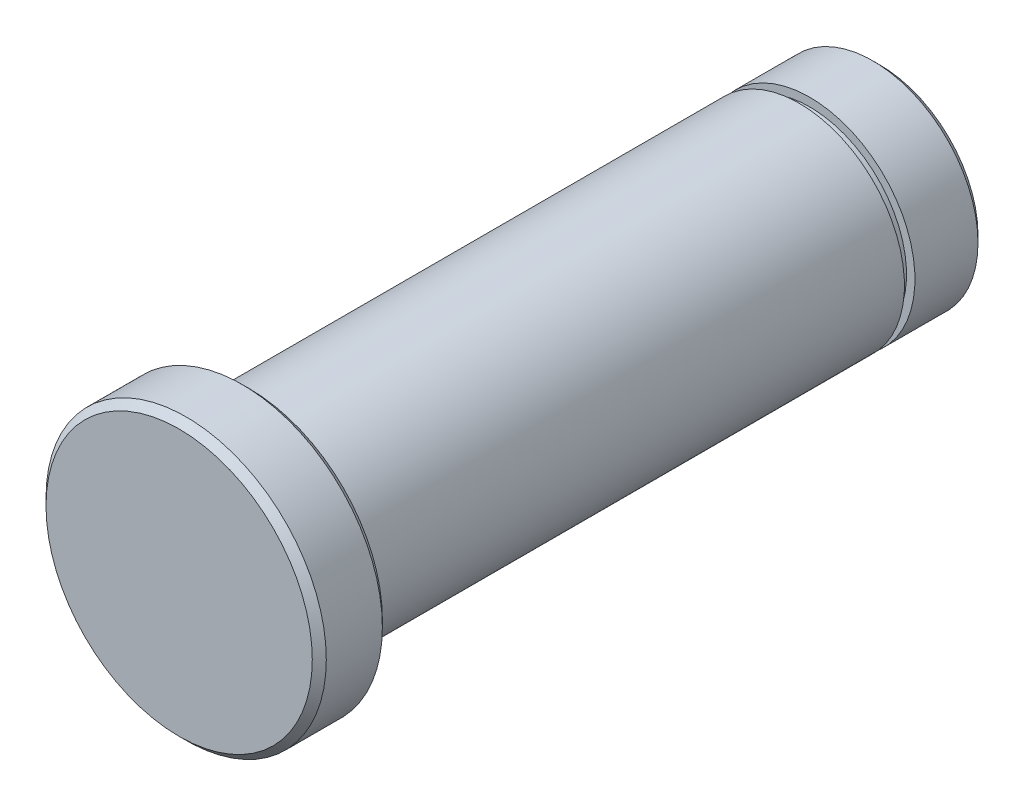
ISO-10303-21;
HEADER;
FILE_DESCRIPTION(('STEP AP214'),'2;1');
FILE_NAME('part.step','',(''),(''),'','','');
FILE_SCHEMA(('AUTOMOTIVE_DESIGN { 1 0 10303 214 1 1 1 1 }'));
ENDSEC;
DATA;
#1=APPLICATION_CONTEXT('core data for automotive mechanical design processes');
#2=APPLICATION_PROTOCOL_DEFINITION('international standard','automotive_design',2000,#1);
#3=PRODUCT_CONTEXT('',#1,'mechanical');
#4=PRODUCT('Part','Part','',(#3));
#5=PRODUCT_RELATED_PRODUCT_CATEGORY('part','',(#4));
#6=PRODUCT_DEFINITION_FORMATION('','',#4);
#7=PRODUCT_DEFINITION_CONTEXT('part definition',#1,'design');
#8=PRODUCT_DEFINITION('design','',#6,#7);
#9=PRODUCT_DEFINITION_SHAPE('','',#8);
#10=(LENGTH_UNIT() NAMED_UNIT(*) SI_UNIT(.MILLI.,.METRE.));
#11=(NAMED_UNIT(*) PLANE_ANGLE_UNIT() SI_UNIT($,.RADIAN.));
#12=(NAMED_UNIT(*) SI_UNIT($,.STERADIAN.) SOLID_ANGLE_UNIT());
#13=UNCERTAINTY_MEASURE_WITH_UNIT(LENGTH_MEASURE(1.E-05),#10,'distance_accuracy_value','');
#14=(GEOMETRIC_REPRESENTATION_CONTEXT(3) GLOBAL_UNCERTAINTY_ASSIGNED_CONTEXT((#13)) GLOBAL_UNIT_ASSIGNED_CONTEXT((#10,
#11,#12)) REPRESENTATION_CONTEXT('',''));
#15=CARTESIAN_POINT('',(0.,0.,0.));
#16=DIRECTION('',(0.,0.,1.));
#17=DIRECTION('',(1.,0.,0.));
#18=AXIS2_PLACEMENT_3D('',#15,#16,#17);
#19=CARTESIAN_POINT('',(0.,0.,90.));
#20=DIRECTION('',(0.,0.,-1.));
#21=DIRECTION('',(-1.,0.,0.));
#22=AXIS2_PLACEMENT_3D('',#19,#20,#21);
#23=CYLINDRICAL_SURFACE('',#22,15.);
#24=CARTESIAN_POINT('',(0.,0.,11.5));
#25=DIRECTION('',(0.,0.,1.));
#26=DIRECTION('',(1.,0.,0.));
#27=AXIS2_PLACEMENT_3D('',#24,#25,#26);
#28=CIRCLE('',#27,15.);
#29=CARTESIAN_POINT('',(-15.,0.,11.5));
#30=VERTEX_POINT('',#29);
#31=EDGE_CURVE('E61',#30,#30,#28,.T.);
#32=CARTESIAN_POINT('',(0.,0.,90.));
#33=DIRECTION('',(0.,0.,1.));
#34=DIRECTION('',(1.,0.,0.));
#35=AXIS2_PLACEMENT_3D('',#32,#33,#34);
#36=CIRCLE('',#35,15.);
#37=CARTESIAN_POINT('',(-15.,0.,90.));
#38=VERTEX_POINT('',#37);
#39=EDGE_CURVE('E60',#38,#38,#36,.T.);
#40=CARTESIAN_POINT('',(-15.,0.,11.5));
#41=CARTESIAN_POINT('',(-15.,0.,12.3177083333333));
#42=CARTESIAN_POINT('',(-15.,0.,13.1354166666667));
#43=CARTESIAN_POINT('',(-15.,0.,14.7708333333333));
#44=CARTESIAN_POINT('',(-15.,0.,15.5885416666667));
#45=CARTESIAN_POINT('',(-15.,0.,17.2239583333333));
#46=CARTESIAN_POINT('',(-15.,0.,18.0416666666667));
#47=CARTESIAN_POINT('',(-15.,0.,19.6770833333333));
#48=CARTESIAN_POINT('',(-15.,0.,20.4947916666667));
#49=CARTESIAN_POINT('',(-15.,0.,22.1302083333333));
#50=CARTESIAN_POINT('',(-15.,0.,22.9479166666667));
#51=CARTESIAN_POINT('',(-15.,0.,24.5833333333333));
#52=CARTESIAN_POINT('',(-15.,0.,25.4010416666667));
#53=CARTESIAN_POINT('',(-15.,0.,27.0364583333333));
#54=CARTESIAN_POINT('',(-15.,0.,27.8541666666667));
#55=CARTESIAN_POINT('',(-15.,0.,29.4895833333333));
#56=CARTESIAN_POINT('',(-15.,0.,30.3072916666667));
#57=CARTESIAN_POINT('',(-15.,0.,31.9427083333333));
#58=CARTESIAN_POINT('',(-15.,0.,32.7604166666667));
#59=CARTESIAN_POINT('',(-15.,0.,34.3958333333333));
#60=CARTESIAN_POINT('',(-15.,0.,35.2135416666667));
#61=CARTESIAN_POINT('',(-15.,0.,36.8489583333333));
#62=CARTESIAN_POINT('',(-15.,0.,37.6666666666667));
#63=CARTESIAN_POINT('',(-15.,0.,39.3020833333333));
#64=CARTESIAN_POINT('',(-15.,0.,40.1197916666667));
#65=CARTESIAN_POINT('',(-15.,0.,41.7552083333333));
#66=CARTESIAN_POINT('',(-15.,0.,42.5729166666667));
#67=CARTESIAN_POINT('',(-15.,0.,44.2083333333333));
#68=CARTESIAN_POINT('',(-15.,0.,45.0260416666667));
#69=CARTESIAN_POINT('',(-15.,0.,46.6614583333333));
#70=CARTESIAN_POINT('',(-15.,0.,47.4791666666667));
#71=CARTESIAN_POINT('',(-15.,0.,49.1145833333333));
#72=CARTESIAN_POINT('',(-15.,0.,49.9322916666667));
#73=CARTESIAN_POINT('',(-15.,0.,51.5677083333333));
#74=CARTESIAN_POINT('',(-15.,0.,52.3854166666667));
#75=CARTESIAN_POINT('',(-15.,0.,54.0208333333333));
#76=CARTESIAN_POINT('',(-15.,0.,54.8385416666667));
#77=CARTESIAN_POINT('',(-15.,0.,56.4739583333333));
#78=CARTESIAN_POINT('',(-15.,0.,57.2916666666667));
#79=CARTESIAN_POINT('',(-15.,0.,58.9270833333333));
#80=CARTESIAN_POINT('',(-15.,0.,59.7447916666667));
#81=CARTESIAN_POINT('',(-15.,0.,61.3802083333333));
#82=CARTESIAN_POINT('',(-15.,0.,62.1979166666667));
#83=CARTESIAN_POINT('',(-15.,0.,63.8333333333333));
#84=CARTESIAN_POINT('',(-15.,0.,64.6510416666667));
#85=CARTESIAN_POINT('',(-15.,0.,66.2864583333333));
#86=CARTESIAN_POINT('',(-15.,0.,67.1041666666667));
#87=CARTESIAN_POINT('',(-15.,0.,68.7395833333333));
#88=CARTESIAN_POINT('',(-15.,0.,69.5572916666666));
#89=CARTESIAN_POINT('',(-15.,0.,71.1927083333333));
#90=CARTESIAN_POINT('',(-15.,0.,72.0104166666666));
#91=CARTESIAN_POINT('',(-15.,0.,73.6458333333333));
#92=CARTESIAN_POINT('',(-15.,0.,74.4635416666666));
#93=CARTESIAN_POINT('',(-15.,0.,76.0989583333333));
#94=CARTESIAN_POINT('',(-15.,0.,76.9166666666666));
#95=CARTESIAN_POINT('',(-15.,0.,78.5520833333333));
#96=CARTESIAN_POINT('',(-15.,0.,79.3697916666666));
#97=CARTESIAN_POINT('',(-15.,0.,81.0052083333333));
#98=CARTESIAN_POINT('',(-15.,0.,81.8229166666666));
#99=CARTESIAN_POINT('',(-15.,0.,83.4583333333333));
#100=CARTESIAN_POINT('',(-15.,0.,84.2760416666666));
#101=CARTESIAN_POINT('',(-15.,0.,85.9114583333333));
#102=CARTESIAN_POINT('',(-15.,0.,86.7291666666666));
#103=CARTESIAN_POINT('',(-15.,0.,88.3645833333333));
#104=CARTESIAN_POINT('',(-15.,0.,89.1822916666666));
#105=CARTESIAN_POINT('',(-15.,0.,90.));
#106=B_SPLINE_CURVE_WITH_KNOTS('',3,(#40,#41,#42,#43,#44,#45,#46,#47,#48,#49,#50,#51,#52,#53,
#54,#55,#56,#57,#58,#59,#60,#61,#62,#63,#64,#65,#66,#67,#68,#69,#70,#71,#72,#73,#74,#75,#76,#77,
#78,#79,#80,#81,#82,#83,#84,#85,#86,#87,#88,#89,#90,#91,#92,#93,#94,#95,#96,#97,#98,#99,#100,
#101,#102,#103,#104,#105),.UNSPECIFIED.,.F.,.F.,(4,2,2,2,2,2,2,2,2,2,2,2,2,2,2,2,2,2,2,2,2,2,2,
2,2,2,2,2,2,2,2,2,4),(0.,2.453125,4.90625,7.359375,9.8125,12.265625,14.71875,17.171875,19.625,
22.078125,24.53125,26.984375,29.4375,31.890625,34.34375,36.796875,39.25,41.703125,44.15625,
46.609375,49.0625,51.515625,53.96875,56.421875,58.875,61.328125,63.78125,66.234375,68.6875,
71.140625,73.59375,76.046875,78.5),.UNSPECIFIED.);
#107=EDGE_CURVE('BSEAM34',#30,#38,#106,.T.);
#108=ORIENTED_EDGE('',*,*,#31,.T.);
#109=ORIENTED_EDGE('',*,*,#39,.F.);
#110=ORIENTED_EDGE('',*,*,#107,.T.);
#111=ORIENTED_EDGE('',*,*,#107,.F.);
#112=EDGE_LOOP('',(#108,#110,#109,#111));
#113=FACE_BOUND('',#112,.T.);
#114=ADVANCED_FACE('F34',(#113),#23,.T.);
#115=CARTESIAN_POINT('',(0.,0.,90.));
#116=DIRECTION('',(0.,0.,1.));
#117=DIRECTION('',(1.,0.,0.));
#118=AXIS2_PLACEMENT_3D('',#115,#116,#117);
#119=PLANE('',#118);
#120=CARTESIAN_POINT('',(0.,0.,90.));
#121=DIRECTION('',(0.,0.,1.));
#122=DIRECTION('',(1.,0.,0.));
#123=AXIS2_PLACEMENT_3D('',#120,#121,#122);
#124=CIRCLE('',#123,19.);
#125=CARTESIAN_POINT('',(19.,0.,90.));
#126=VERTEX_POINT('',#125);
#127=EDGE_CURVE('E10',#126,#126,#124,.F.);
#128=ORIENTED_EDGE('',*,*,#127,.T.);
#129=EDGE_LOOP('',(#128));
#130=FACE_BOUND('',#129,.T.);
#131=ORIENTED_EDGE('',*,*,#39,.T.);
#132=EDGE_LOOP('',(#131));
#133=FACE_BOUND('',#132,.T.);
#134=ADVANCED_FACE('F95',(#130,#133),#119,.F.);
#135=CARTESIAN_POINT('',(0.,0.,100.));
#136=DIRECTION('',(0.,0.,-1.));
#137=DIRECTION('',(-1.,0.,0.));
#138=AXIS2_PLACEMENT_3D('',#135,#136,#137);
#139=CYLINDRICAL_SURFACE('',#138,20.);
#140=CARTESIAN_POINT('',(0.,0.,99.));
#141=DIRECTION('',(0.,0.,1.));
#142=DIRECTION('',(1.,0.,0.));
#143=AXIS2_PLACEMENT_3D('',#140,#141,#142);
#144=CIRCLE('',#143,20.);
#145=CARTESIAN_POINT('',(20.,0.,99.));
#146=VERTEX_POINT('',#145);
#147=EDGE_CURVE('E41',#146,#146,#144,.F.);
#148=ORIENTED_EDGE('',*,*,#147,.T.);
#149=EDGE_LOOP('',(#148));
#150=FACE_BOUND('',#149,.T.);
#151=CARTESIAN_POINT('',(0.,0.,91.));
#152=DIRECTION('',(0.,0.,1.));
#153=DIRECTION('',(1.,0.,0.));
#154=AXIS2_PLACEMENT_3D('',#151,#152,#153);
#155=CIRCLE('',#154,20.);
#156=CARTESIAN_POINT('',(20.,0.,91.));
#157=VERTEX_POINT('',#156);
#158=EDGE_CURVE('E45',#157,#157,#155,.T.);
#159=ORIENTED_EDGE('',*,*,#158,.T.);
#160=EDGE_LOOP('',(#159));
#161=FACE_BOUND('',#160,.T.);
#162=ADVANCED_FACE('F101',(#150,#161),#139,.T.);
#163=CARTESIAN_POINT('',(0.,0.,100.));
#164=DIRECTION('',(0.,0.,1.));
#165=DIRECTION('',(1.,0.,0.));
#166=AXIS2_PLACEMENT_3D('',#163,#164,#165);
#167=PLANE('',#166);
#168=CARTESIAN_POINT('',(0.,0.,100.));
#169=DIRECTION('',(0.,0.,1.));
#170=DIRECTION('',(1.,0.,0.));
#171=AXIS2_PLACEMENT_3D('',#168,#169,#170);
#172=CIRCLE('',#171,19.);
#173=CARTESIAN_POINT('',(19.,0.,100.));
#174=VERTEX_POINT('',#173);
#175=EDGE_CURVE('E49',#174,#174,#172,.T.);
#176=ORIENTED_EDGE('',*,*,#175,.T.);
#177=EDGE_LOOP('',(#176));
#178=FACE_BOUND('',#177,.T.);
#179=ADVANCED_FACE('F89',(#178),#167,.T.);
#180=CARTESIAN_POINT('',(-17.8321139947971,0.,11.5));
#181=DIRECTION('',(0.,0.,1.));
#182=DIRECTION('',(1.,0.,0.));
#183=AXIS2_PLACEMENT_3D('',#180,#181,#182);
#184=PLANE('',#183);
#185=CARTESIAN_POINT('',(0.,0.,11.5));
#186=DIRECTION('',(0.,0.,-1.));
#187=DIRECTION('',(-1.,0.,0.));
#188=AXIS2_PLACEMENT_3D('',#185,#186,#187);
#189=CIRCLE('',#188,13.8);
#190=CARTESIAN_POINT('',(-13.8,0.,11.5));
#191=VERTEX_POINT('',#190);
#192=EDGE_CURVE('E67',#191,#191,#189,.T.);
#193=ORIENTED_EDGE('',*,*,#192,.F.);
#194=EDGE_LOOP('',(#193));
#195=FACE_BOUND('',#194,.T.);
#196=ORIENTED_EDGE('',*,*,#31,.F.);
#197=EDGE_LOOP('',(#196));
#198=FACE_BOUND('',#197,.T.);
#199=ADVANCED_FACE('F86',(#195,#198),#184,.F.);
#200=CARTESIAN_POINT('',(-17.8321139947971,0.,10.));
#201=DIRECTION('',(0.,0.,-1.));
#202=DIRECTION('',(-1.,0.,0.));
#203=AXIS2_PLACEMENT_3D('',#200,#201,#202);
#204=PLANE('',#203);
#205=CARTESIAN_POINT('',(0.,0.,10.));
#206=DIRECTION('',(0.,0.,-1.));
#207=DIRECTION('',(-1.,0.,0.));
#208=AXIS2_PLACEMENT_3D('',#205,#206,#207);
#209=CIRCLE('',#208,13.8);
#210=CARTESIAN_POINT('',(-13.8,0.,10.));
#211=VERTEX_POINT('',#210);
#212=EDGE_CURVE('E72',#211,#211,#209,.T.);
#213=ORIENTED_EDGE('',*,*,#212,.T.);
#214=EDGE_LOOP('',(#213));
#215=FACE_BOUND('',#214,.T.);
#216=CARTESIAN_POINT('',(0.,0.,9.99999999999999));
#217=DIRECTION('',(0.,0.,-1.));
#218=DIRECTION('',(-1.,0.,0.));
#219=AXIS2_PLACEMENT_3D('',#216,#217,#218);
#220=CIRCLE('',#219,15.);
#221=CARTESIAN_POINT('',(-15.,0.,9.99999999999999));
#222=VERTEX_POINT('',#221);
#223=EDGE_CURVE('E64',#222,#222,#220,.T.);
#224=ORIENTED_EDGE('',*,*,#223,.F.);
#225=EDGE_LOOP('',(#224));
#226=FACE_BOUND('',#225,.T.);
#227=ADVANCED_FACE('F76',(#215,#226),#204,.F.);
#228=CARTESIAN_POINT('',(0.,0.,0.));
#229=DIRECTION('',(0.,0.,-1.));
#230=DIRECTION('',(-1.,0.,0.));
#231=AXIS2_PLACEMENT_3D('',#228,#229,#230);
#232=CYLINDRICAL_SURFACE('',#231,13.8);
#233=ORIENTED_EDGE('',*,*,#212,.F.);
#234=EDGE_LOOP('',(#233));
#235=FACE_BOUND('',#234,.T.);
#236=ORIENTED_EDGE('',*,*,#192,.T.);
#237=EDGE_LOOP('',(#236));
#238=FACE_BOUND('',#237,.T.);
#239=ADVANCED_FACE('F79',(#235,#238),#232,.T.);
#240=CARTESIAN_POINT('',(0.,0.,0.));
#241=DIRECTION('',(0.,0.,1.));
#242=DIRECTION('',(1.,0.,0.));
#243=AXIS2_PLACEMENT_3D('',#240,#241,#242);
#244=PLANE('',#243);
#245=CARTESIAN_POINT('',(0.,0.,0.));
#246=DIRECTION('',(0.,0.,1.));
#247=DIRECTION('',(1.,0.,0.));
#248=AXIS2_PLACEMENT_3D('',#245,#246,#247);
#249=CIRCLE('',#248,13.9999999999999);
#250=CARTESIAN_POINT('',(13.9999999999999,0.,0.));
#251=VERTEX_POINT('',#250);
#252=EDGE_CURVE('E54',#251,#251,#249,.F.);
#253=ORIENTED_EDGE('',*,*,#252,.T.);
#254=EDGE_LOOP('',(#253));
#255=FACE_BOUND('',#254,.T.);
#256=ADVANCED_FACE('F82',(#255),#244,.F.);
#257=CARTESIAN_POINT('',(0.,0.,1.00000000000008));
#258=DIRECTION('',(0.,0.,1.));
#259=DIRECTION('',(1.,0.,0.));
#260=AXIS2_PLACEMENT_3D('',#257,#258,#259);
#261=CIRCLE('',#260,15.);
#262=CARTESIAN_POINT('',(-15.,0.,1.00000000000007));
#263=VERTEX_POINT('',#262);
#264=EDGE_CURVE('E57',#263,#263,#261,.T.);
#265=CARTESIAN_POINT('',(-15.,0.,1.00000000000007));
#266=CARTESIAN_POINT('',(-15.,0.,1.09375000000007));
#267=CARTESIAN_POINT('',(-15.,0.,1.18750000000007));
#268=CARTESIAN_POINT('',(-15.,0.,1.37500000000007));
#269=CARTESIAN_POINT('',(-15.,0.,1.46875000000006));
#270=CARTESIAN_POINT('',(-15.,0.,1.65625000000006));
#271=CARTESIAN_POINT('',(-15.,0.,1.75000000000006));
#272=CARTESIAN_POINT('',(-15.,0.,1.93750000000006));
#273=CARTESIAN_POINT('',(-15.,0.,2.03125000000006));
#274=CARTESIAN_POINT('',(-15.,0.,2.21875000000006));
#275=CARTESIAN_POINT('',(-15.,0.,2.31250000000006));
#276=CARTESIAN_POINT('',(-15.,0.,2.50000000000005));
#277=CARTESIAN_POINT('',(-15.,0.,2.59375000000005));
#278=CARTESIAN_POINT('',(-15.,0.,2.78125000000005));
#279=CARTESIAN_POINT('',(-15.,0.,2.87500000000005));
#280=CARTESIAN_POINT('',(-15.,0.,3.06250000000005));
#281=CARTESIAN_POINT('',(-15.,0.,3.15625000000005));
#282=CARTESIAN_POINT('',(-15.,0.,3.34375000000005));
#283=CARTESIAN_POINT('',(-15.,0.,3.43750000000005));
#284=CARTESIAN_POINT('',(-15.,0.,3.62500000000005));
#285=CARTESIAN_POINT('',(-15.,0.,3.71875000000005));
#286=CARTESIAN_POINT('',(-15.,0.,3.90625000000005));
#287=CARTESIAN_POINT('',(-15.,0.,4.00000000000005));
#288=CARTESIAN_POINT('',(-15.,0.,4.18750000000005));
#289=CARTESIAN_POINT('',(-15.,0.,4.28125000000005));
#290=CARTESIAN_POINT('',(-15.,0.,4.46875000000004));
#291=CARTESIAN_POINT('',(-15.,0.,4.56250000000004));
#292=CARTESIAN_POINT('',(-15.,0.,4.75000000000004));
#293=CARTESIAN_POINT('',(-15.,0.,4.84375000000004));
#294=CARTESIAN_POINT('',(-15.,0.,5.03125000000004));
#295=CARTESIAN_POINT('',(-15.,0.,5.12500000000004));
#296=CARTESIAN_POINT('',(-15.,0.,5.31250000000003));
#297=CARTESIAN_POINT('',(-15.,0.,5.40625000000003));
#298=CARTESIAN_POINT('',(-15.,0.,5.59375000000003));
#299=CARTESIAN_POINT('',(-15.,0.,5.68750000000003));
#300=CARTESIAN_POINT('',(-15.,0.,5.87500000000003));
#301=CARTESIAN_POINT('',(-15.,0.,5.96875000000003));
#302=CARTESIAN_POINT('',(-15.,0.,6.15625000000003));
#303=CARTESIAN_POINT('',(-15.,0.,6.25000000000002));
#304=CARTESIAN_POINT('',(-15.,0.,6.43750000000002));
#305=CARTESIAN_POINT('',(-15.,0.,6.53125000000002));
#306=CARTESIAN_POINT('',(-15.,0.,6.71875000000002));
#307=CARTESIAN_POINT('',(-15.,0.,6.81250000000002));
#308=CARTESIAN_POINT('',(-15.,0.,7.00000000000002));
#309=CARTESIAN_POINT('',(-15.,0.,7.09375000000001));
#310=CARTESIAN_POINT('',(-15.,0.,7.28125000000001));
#311=CARTESIAN_POINT('',(-15.,0.,7.37500000000001));
#312=CARTESIAN_POINT('',(-15.,0.,7.56250000000001));
#313=CARTESIAN_POINT('',(-15.,0.,7.65625000000002));
#314=CARTESIAN_POINT('',(-15.,0.,7.84375000000002));
#315=CARTESIAN_POINT('',(-15.,0.,7.93750000000002));
#316=CARTESIAN_POINT('',(-15.,0.,8.12500000000002));
#317=CARTESIAN_POINT('',(-15.,0.,8.21875000000002));
#318=CARTESIAN_POINT('',(-15.,0.,8.40625000000001));
#319=CARTESIAN_POINT('',(-15.,0.,8.50000000000001));
#320=CARTESIAN_POINT('',(-15.,0.,8.68750000000001));
#321=CARTESIAN_POINT('',(-15.,0.,8.78125000000001));
#322=CARTESIAN_POINT('',(-15.,0.,8.96875000000001));
#323=CARTESIAN_POINT('',(-15.,0.,9.06250000000001));
#324=CARTESIAN_POINT('',(-15.,0.,9.25));
#325=CARTESIAN_POINT('',(-15.,0.,9.34375));
#326=CARTESIAN_POINT('',(-15.,0.,9.53125));
#327=CARTESIAN_POINT('',(-15.,0.,9.625));
#328=CARTESIAN_POINT('',(-15.,0.,9.8125));
#329=CARTESIAN_POINT('',(-15.,0.,9.90625));
#330=CARTESIAN_POINT('',(-15.,0.,9.99999999999999));
#331=B_SPLINE_CURVE_WITH_KNOTS('',3,(#265,#266,#267,#268,#269,#270,#271,#272,#273,#274,#275,
#276,#277,#278,#279,#280,#281,#282,#283,#284,#285,#286,#287,#288,#289,#290,#291,#292,#293,#294,
#295,#296,#297,#298,#299,#300,#301,#302,#303,#304,#305,#306,#307,#308,#309,#310,#311,#312,#313,
#314,#315,#316,#317,#318,#319,#320,#321,#322,#323,#324,#325,#326,#327,#328,#329,#330),
.UNSPECIFIED.,.F.,.F.,(4,2,2,2,2,2,2,2,2,2,2,2,2,2,2,2,2,2,2,2,2,2,2,2,2,2,2,2,2,2,2,2,4),(0.,
0.281249999999997,0.562499999999994,0.84374999999999,1.12499999999999,1.40624999999998,
1.68749999999998,1.96874999999998,2.24999999999997,2.53124999999998,2.81249999999998,
3.09374999999998,3.37499999999998,3.65624999999997,3.93749999999997,4.21874999999997,
4.49999999999996,4.78124999999996,5.06249999999996,5.34374999999995,5.62499999999995,
5.90624999999995,6.18749999999994,6.46874999999994,6.74999999999995,7.03124999999995,
7.31249999999994,7.59374999999994,7.87499999999994,8.15624999999993,8.43749999999993,
8.71874999999993,8.99999999999993),.UNSPECIFIED.);
#332=EDGE_CURVE('BSEAM97',#263,#222,#331,.T.);
#333=ORIENTED_EDGE('',*,*,#264,.T.);
#334=ORIENTED_EDGE('',*,*,#223,.T.);
#335=ORIENTED_EDGE('',*,*,#332,.T.);
#336=ORIENTED_EDGE('',*,*,#332,.F.);
#337=EDGE_LOOP('',(#333,#335,#334,#336));
#338=FACE_BOUND('',#337,.T.);
#339=ADVANCED_FACE('F97',(#338),#23,.T.);
#340=CARTESIAN_POINT('',(0.,0.,1.00000000000008));
#341=DIRECTION('',(0.,0.,1.));
#342=DIRECTION('',(1.,0.,0.));
#343=AXIS2_PLACEMENT_3D('',#340,#341,#342);
#344=CONICAL_SURFACE('',#343,15.,0.785398163397449);
#345=ORIENTED_EDGE('',*,*,#252,.F.);
#346=EDGE_LOOP('',(#345));
#347=FACE_BOUND('',#346,.T.);
#348=ORIENTED_EDGE('',*,*,#264,.F.);
#349=EDGE_LOOP('',(#348));
#350=FACE_BOUND('',#349,.T.);
#351=ADVANCED_FACE('F113',(#347,#350),#344,.T.);
#352=CARTESIAN_POINT('',(0.,0.,100.));
#353=DIRECTION('',(0.,0.,-1.));
#354=DIRECTION('',(-1.,0.,0.));
#355=AXIS2_PLACEMENT_3D('',#352,#353,#354);
#356=CONICAL_SURFACE('',#355,19.,0.78539816339746);
#357=ORIENTED_EDGE('',*,*,#147,.F.);
#358=EDGE_LOOP('',(#357));
#359=FACE_BOUND('',#358,.T.);
#360=ORIENTED_EDGE('',*,*,#175,.F.);
#361=EDGE_LOOP('',(#360));
#362=FACE_BOUND('',#361,.T.);
#363=ADVANCED_FACE('F116',(#359,#362),#356,.T.);
#364=CARTESIAN_POINT('',(0.,0.,91.));
#365=DIRECTION('',(0.,0.,1.));
#366=DIRECTION('',(1.,0.,0.));
#367=AXIS2_PLACEMENT_3D('',#364,#365,#366);
#368=CONICAL_SURFACE('',#367,20.,0.785398163397447);
#369=ORIENTED_EDGE('',*,*,#127,.F.);
#370=EDGE_LOOP('',(#369));
#371=FACE_BOUND('',#370,.T.);
#372=ORIENTED_EDGE('',*,*,#158,.F.);
#373=EDGE_LOOP('',(#372));
#374=FACE_BOUND('',#373,.T.);
#375=ADVANCED_FACE('F36',(#371,#374),#368,.T.);
#376=CLOSED_SHELL('',(#114,#134,#162,#179,#199,#227,#239,#256,#339,#351,#363,#375));
#377=MANIFOLD_SOLID_BREP('B2',#376);
#378=ADVANCED_BREP_SHAPE_REPRESENTATION('',(#18,#377),#14);
#379=SHAPE_DEFINITION_REPRESENTATION(#9,#378);
ENDSEC;
END-ISO-10303-21;
